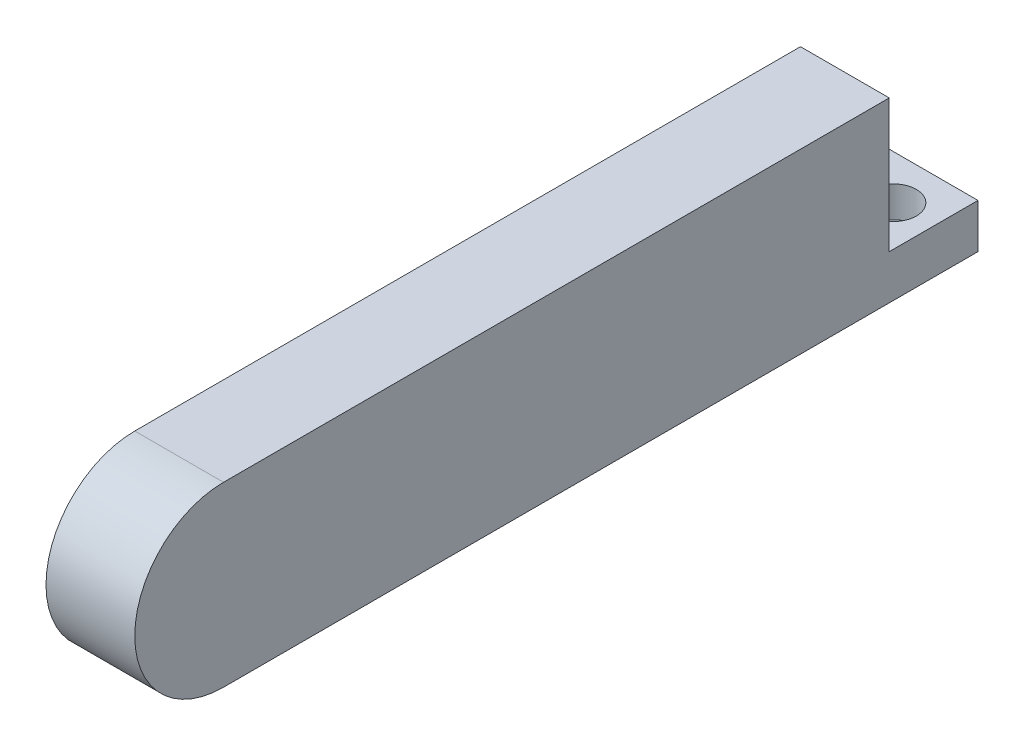
ISO-10303-21;
HEADER;
FILE_DESCRIPTION(('STEP AP214'),'2;1');
FILE_NAME('part.step','',(''),(''),'','','');
FILE_SCHEMA(('AUTOMOTIVE_DESIGN { 1 0 10303 214 1 1 1 1 }'));
ENDSEC;
DATA;
#1=APPLICATION_CONTEXT('core data for automotive mechanical design processes');
#2=APPLICATION_PROTOCOL_DEFINITION('international standard','automotive_design',2000,#1);
#3=PRODUCT_CONTEXT('',#1,'mechanical');
#4=PRODUCT('Part','Part','',(#3));
#5=PRODUCT_RELATED_PRODUCT_CATEGORY('part','',(#4));
#6=PRODUCT_DEFINITION_FORMATION('','',#4);
#7=PRODUCT_DEFINITION_CONTEXT('part definition',#1,'design');
#8=PRODUCT_DEFINITION('design','',#6,#7);
#9=PRODUCT_DEFINITION_SHAPE('','',#8);
#10=(LENGTH_UNIT() NAMED_UNIT(*) SI_UNIT(.MILLI.,.METRE.));
#11=(NAMED_UNIT(*) PLANE_ANGLE_UNIT() SI_UNIT($,.RADIAN.));
#12=(NAMED_UNIT(*) SI_UNIT($,.STERADIAN.) SOLID_ANGLE_UNIT());
#13=UNCERTAINTY_MEASURE_WITH_UNIT(LENGTH_MEASURE(1.E-05),#10,'distance_accuracy_value','');
#14=(GEOMETRIC_REPRESENTATION_CONTEXT(3) GLOBAL_UNCERTAINTY_ASSIGNED_CONTEXT((#13)) GLOBAL_UNIT_ASSIGNED_CONTEXT((#10,
#11,#12)) REPRESENTATION_CONTEXT('',''));
#15=CARTESIAN_POINT('',(0.,0.,0.));
#16=DIRECTION('',(0.,0.,1.));
#17=DIRECTION('',(1.,0.,0.));
#18=AXIS2_PLACEMENT_3D('',#15,#16,#17);
#19=CARTESIAN_POINT('',(20.,20.,150.));
#20=DIRECTION('',(-1.,0.,0.));
#21=DIRECTION('',(0.,0.,1.));
#22=AXIS2_PLACEMENT_3D('',#19,#20,#21);
#23=CYLINDRICAL_SURFACE('',#22,11.);
#24=CARTESIAN_POINT('',(0.,20.,150.));
#25=DIRECTION('',(1.,0.,0.));
#26=DIRECTION('',(0.,0.,-1.));
#27=AXIS2_PLACEMENT_3D('',#24,#25,#26);
#28=CIRCLE('',#27,11.);
#29=CARTESIAN_POINT('',(0.,20.,139.));
#30=VERTEX_POINT('',#29);
#31=EDGE_CURVE('E160',#30,#30,#28,.T.);
#32=ORIENTED_EDGE('',*,*,#31,.F.);
#33=EDGE_LOOP('',(#32));
#34=FACE_BOUND('',#33,.T.);
#35=CARTESIAN_POINT('',(7.,20.,150.));
#36=DIRECTION('',(1.,0.,0.));
#37=DIRECTION('',(0.,0.,-1.));
#38=AXIS2_PLACEMENT_3D('',#35,#36,#37);
#39=CIRCLE('',#38,11.);
#40=CARTESIAN_POINT('',(7.,20.,139.));
#41=VERTEX_POINT('',#40);
#42=EDGE_CURVE('E227',#41,#41,#39,.T.);
#43=ORIENTED_EDGE('',*,*,#42,.T.);
#44=EDGE_LOOP('',(#43));
#45=FACE_BOUND('',#44,.T.);
#46=ADVANCED_FACE('F41',(#34,#45),#23,.F.);
#47=CARTESIAN_POINT('',(20.,0.,0.));
#48=DIRECTION('',(0.,0.,-1.));
#49=DIRECTION('',(-1.,0.,0.));
#50=AXIS2_PLACEMENT_3D('',#47,#48,#49);
#51=PLANE('',#50);
#52=DIRECTION('',(0.,-1.,0.));
#53=VECTOR('',#52,1.);
#54=CARTESIAN_POINT('',(20.,0.,0.));
#55=LINE('',#54,#53);
#56=CARTESIAN_POINT('',(20.,40.,0.));
#57=VERTEX_POINT('',#56);
#58=CARTESIAN_POINT('',(20.,10.,0.));
#59=VERTEX_POINT('',#58);
#60=EDGE_CURVE('E168',#57,#59,#55,.T.);
#61=ORIENTED_EDGE('',*,*,#60,.T.);
#62=DIRECTION('',(-1.,0.,0.));
#63=VECTOR('',#62,1.);
#64=CARTESIAN_POINT('',(20.,10.,0.));
#65=LINE('',#64,#63);
#66=CARTESIAN_POINT('',(0.,10.,0.));
#67=VERTEX_POINT('',#66);
#68=EDGE_CURVE('E127',#59,#67,#65,.T.);
#69=ORIENTED_EDGE('',*,*,#68,.T.);
#70=DIRECTION('',(0.,-1.,0.));
#71=VECTOR('',#70,1.);
#72=CARTESIAN_POINT('',(0.,0.,0.));
#73=LINE('',#72,#71);
#74=CARTESIAN_POINT('',(0.,40.,0.));
#75=VERTEX_POINT('',#74);
#76=EDGE_CURVE('E184',#75,#67,#73,.T.);
#77=ORIENTED_EDGE('',*,*,#76,.F.);
#78=DIRECTION('',(-1.,0.,0.));
#79=VECTOR('',#78,1.);
#80=CARTESIAN_POINT('',(20.,40.,0.));
#81=LINE('',#80,#79);
#82=EDGE_CURVE('E192',#57,#75,#81,.T.);
#83=ORIENTED_EDGE('',*,*,#82,.F.);
#84=EDGE_LOOP('',(#61,#69,#77,#83));
#85=FACE_BOUND('',#84,.T.);
#86=ADVANCED_FACE('F217',(#85),#51,.T.);
#87=CARTESIAN_POINT('',(20.,20.,150.));
#88=DIRECTION('',(-1.,0.,0.));
#89=DIRECTION('',(0.,0.,1.));
#90=AXIS2_PLACEMENT_3D('',#87,#88,#89);
#91=CYLINDRICAL_SURFACE('',#90,20.);
#92=CARTESIAN_POINT('',(0.,20.,150.));
#93=DIRECTION('',(1.,0.,0.));
#94=DIRECTION('',(0.,0.,-1.));
#95=AXIS2_PLACEMENT_3D('',#92,#93,#94);
#96=CIRCLE('',#95,20.);
#97=CARTESIAN_POINT('',(0.,40.,150.));
#98=VERTEX_POINT('',#97);
#99=CARTESIAN_POINT('',(0.,0.,150.));
#100=VERTEX_POINT('',#99);
#101=EDGE_CURVE('E178',#98,#100,#96,.T.);
#102=ORIENTED_EDGE('',*,*,#101,.T.);
#103=DIRECTION('',(-1.,0.,0.));
#104=VECTOR('',#103,1.);
#105=CARTESIAN_POINT('',(20.,0.,150.));
#106=LINE('',#105,#104);
#107=CARTESIAN_POINT('',(20.,0.,150.));
#108=VERTEX_POINT('',#107);
#109=EDGE_CURVE('E44',#108,#100,#106,.T.);
#110=ORIENTED_EDGE('',*,*,#109,.F.);
#111=CARTESIAN_POINT('',(20.,20.,150.));
#112=DIRECTION('',(1.,0.,0.));
#113=DIRECTION('',(0.,0.,-1.));
#114=AXIS2_PLACEMENT_3D('',#111,#112,#113);
#115=CIRCLE('',#114,20.);
#116=CARTESIAN_POINT('',(20.,40.,150.));
#117=VERTEX_POINT('',#116);
#118=EDGE_CURVE('E87',#117,#108,#115,.T.);
#119=ORIENTED_EDGE('',*,*,#118,.F.);
#120=DIRECTION('',(-1.,0.,0.));
#121=VECTOR('',#120,1.);
#122=CARTESIAN_POINT('',(20.,40.,150.));
#123=LINE('',#122,#121);
#124=EDGE_CURVE('E66',#117,#98,#123,.T.);
#125=ORIENTED_EDGE('',*,*,#124,.T.);
#126=EDGE_LOOP('',(#102,#110,#119,#125));
#127=FACE_BOUND('',#126,.T.);
#128=ADVANCED_FACE('F200',(#127),#91,.T.);
#129=CARTESIAN_POINT('',(20.,0.,0.));
#130=DIRECTION('',(0.,-1.,0.));
#131=DIRECTION('',(0.,0.,-1.));
#132=AXIS2_PLACEMENT_3D('',#129,#130,#131);
#133=PLANE('',#132);
#134=CARTESIAN_POINT('',(10.900977193927,0.,-10.));
#135=DIRECTION('',(0.,1.,0.));
#136=DIRECTION('',(0.,0.,1.));
#137=AXIS2_PLACEMENT_3D('',#134,#135,#136);
#138=CIRCLE('',#137,3.15);
#139=CARTESIAN_POINT('',(10.900977193927,0.,-6.85));
#140=VERTEX_POINT('',#139);
#141=EDGE_CURVE('E234',#140,#140,#138,.T.);
#142=ORIENTED_EDGE('',*,*,#141,.T.);
#143=EDGE_LOOP('',(#142));
#144=FACE_BOUND('',#143,.T.);
#145=CARTESIAN_POINT('',(-10.,0.,59.0289112452638));
#146=DIRECTION('',(0.,1.,0.));
#147=DIRECTION('',(0.,0.,1.));
#148=AXIS2_PLACEMENT_3D('',#145,#146,#147);
#149=CIRCLE('',#148,3.15);
#150=CARTESIAN_POINT('',(-10.,0.,62.1789112452638));
#151=VERTEX_POINT('',#150);
#152=EDGE_CURVE('E241',#151,#151,#149,.T.);
#153=ORIENTED_EDGE('',*,*,#152,.T.);
#154=EDGE_LOOP('',(#153));
#155=FACE_BOUND('',#154,.T.);
#156=CARTESIAN_POINT('',(-10.,0.,17.7070334327709));
#157=DIRECTION('',(0.,1.,0.));
#158=DIRECTION('',(0.,0.,1.));
#159=AXIS2_PLACEMENT_3D('',#156,#157,#158);
#160=CIRCLE('',#159,3.15);
#161=CARTESIAN_POINT('',(-10.,0.,20.8570334327709));
#162=VERTEX_POINT('',#161);
#163=EDGE_CURVE('E249',#162,#162,#160,.T.);
#164=ORIENTED_EDGE('',*,*,#163,.T.);
#165=EDGE_LOOP('',(#164));
#166=FACE_BOUND('',#165,.T.);
#167=DIRECTION('',(0.,0.,1.));
#168=VECTOR('',#167,1.);
#169=CARTESIAN_POINT('',(0.,0.,0.));
#170=LINE('',#169,#168);
#171=CARTESIAN_POINT('',(0.,0.,75.));
#172=VERTEX_POINT('',#171);
#173=EDGE_CURVE('E181',#172,#100,#170,.T.);
#174=ORIENTED_EDGE('',*,*,#173,.F.);
#175=DIRECTION('',(-1.,0.,0.));
#176=VECTOR('',#175,1.);
#177=CARTESIAN_POINT('',(0.,0.,75.));
#178=LINE('',#177,#176);
#179=CARTESIAN_POINT('',(-20.,0.,75.));
#180=VERTEX_POINT('',#179);
#181=EDGE_CURVE('E57',#172,#180,#178,.T.);
#182=ORIENTED_EDGE('',*,*,#181,.T.);
#183=DIRECTION('',(0.,0.,1.));
#184=VECTOR('',#183,1.);
#185=CARTESIAN_POINT('',(-20.,0.,-20.));
#186=LINE('',#185,#184);
#187=CARTESIAN_POINT('',(-20.,0.,-20.));
#188=VERTEX_POINT('',#187);
#189=EDGE_CURVE('E277',#188,#180,#186,.T.);
#190=ORIENTED_EDGE('',*,*,#189,.F.);
#191=DIRECTION('',(-1.,0.,0.));
#192=VECTOR('',#191,1.);
#193=CARTESIAN_POINT('',(20.,0.,-20.));
#194=LINE('',#193,#192);
#195=CARTESIAN_POINT('',(20.,0.,-20.));
#196=VERTEX_POINT('',#195);
#197=EDGE_CURVE('E128',#196,#188,#194,.T.);
#198=ORIENTED_EDGE('',*,*,#197,.F.);
#199=DIRECTION('',(0.,0.,1.));
#200=VECTOR('',#199,1.);
#201=CARTESIAN_POINT('',(20.,0.,0.));
#202=LINE('',#201,#200);
#203=EDGE_CURVE('E163',#196,#108,#202,.T.);
#204=ORIENTED_EDGE('',*,*,#203,.T.);
#205=ORIENTED_EDGE('',*,*,#109,.T.);
#206=EDGE_LOOP('',(#174,#182,#190,#198,#204,#205));
#207=FACE_BOUND('',#206,.T.);
#208=ADVANCED_FACE('F199',(#144,#155,#166,#207),#133,.T.);
#209=CARTESIAN_POINT('',(20.,40.,0.));
#210=DIRECTION('',(0.,1.,0.));
#211=DIRECTION('',(0.,0.,1.));
#212=AXIS2_PLACEMENT_3D('',#209,#210,#211);
#213=PLANE('',#212);
#214=DIRECTION('',(0.,0.,-1.));
#215=VECTOR('',#214,1.);
#216=CARTESIAN_POINT('',(0.,40.,0.));
#217=LINE('',#216,#215);
#218=EDGE_CURVE('E164',#98,#75,#217,.T.);
#219=ORIENTED_EDGE('',*,*,#218,.F.);
#220=ORIENTED_EDGE('',*,*,#124,.F.);
#221=DIRECTION('',(0.,0.,-1.));
#222=VECTOR('',#221,1.);
#223=CARTESIAN_POINT('',(20.,40.,0.));
#224=LINE('',#223,#222);
#225=EDGE_CURVE('E172',#117,#57,#224,.T.);
#226=ORIENTED_EDGE('',*,*,#225,.T.);
#227=ORIENTED_EDGE('',*,*,#82,.T.);
#228=EDGE_LOOP('',(#219,#220,#226,#227));
#229=FACE_BOUND('',#228,.T.);
#230=ADVANCED_FACE('F203',(#229),#213,.T.);
#231=CARTESIAN_POINT('',(20.,0.,0.));
#232=DIRECTION('',(1.,0.,0.));
#233=DIRECTION('',(0.,0.,-1.));
#234=AXIS2_PLACEMENT_3D('',#231,#232,#233);
#235=PLANE('',#234);
#236=ORIENTED_EDGE('',*,*,#118,.T.);
#237=ORIENTED_EDGE('',*,*,#203,.F.);
#238=DIRECTION('',(0.,-1.,0.));
#239=VECTOR('',#238,1.);
#240=CARTESIAN_POINT('',(20.,10.,-20.));
#241=LINE('',#240,#239);
#242=CARTESIAN_POINT('',(20.,10.,-20.));
#243=VERTEX_POINT('',#242);
#244=EDGE_CURVE('E156',#243,#196,#241,.T.);
#245=ORIENTED_EDGE('',*,*,#244,.F.);
#246=DIRECTION('',(0.,0.,-1.));
#247=VECTOR('',#246,1.);
#248=CARTESIAN_POINT('',(20.,10.,0.));
#249=LINE('',#248,#247);
#250=EDGE_CURVE('E121',#59,#243,#249,.T.);
#251=ORIENTED_EDGE('',*,*,#250,.F.);
#252=ORIENTED_EDGE('',*,*,#60,.F.);
#253=ORIENTED_EDGE('',*,*,#225,.F.);
#254=EDGE_LOOP('',(#236,#237,#245,#251,#252,#253));
#255=FACE_BOUND('',#254,.T.);
#256=ADVANCED_FACE('F205',(#255),#235,.T.);
#257=CARTESIAN_POINT('',(0.,0.,0.));
#258=DIRECTION('',(1.,0.,0.));
#259=DIRECTION('',(0.,0.,-1.));
#260=AXIS2_PLACEMENT_3D('',#257,#258,#259);
#261=PLANE('',#260);
#262=ORIENTED_EDGE('',*,*,#31,.T.);
#263=EDGE_LOOP('',(#262));
#264=FACE_BOUND('',#263,.T.);
#265=ORIENTED_EDGE('',*,*,#76,.T.);
#266=DIRECTION('',(0.,0.,1.));
#267=VECTOR('',#266,1.);
#268=CARTESIAN_POINT('',(0.,10.,-20.));
#269=LINE('',#268,#267);
#270=CARTESIAN_POINT('',(0.,10.,75.));
#271=VERTEX_POINT('',#270);
#272=EDGE_CURVE('E11',#67,#271,#269,.T.);
#273=ORIENTED_EDGE('',*,*,#272,.T.);
#274=DIRECTION('',(0.,-1.,0.));
#275=VECTOR('',#274,1.);
#276=CARTESIAN_POINT('',(0.,10.,75.));
#277=LINE('',#276,#275);
#278=EDGE_CURVE('E148',#271,#172,#277,.T.);
#279=ORIENTED_EDGE('',*,*,#278,.T.);
#280=ORIENTED_EDGE('',*,*,#173,.T.);
#281=ORIENTED_EDGE('',*,*,#101,.F.);
#282=ORIENTED_EDGE('',*,*,#218,.T.);
#283=EDGE_LOOP('',(#265,#273,#279,#280,#281,#282));
#284=FACE_BOUND('',#283,.T.);
#285=ADVANCED_FACE('F202',(#264,#284),#261,.F.);
#286=CARTESIAN_POINT('',(20.,10.,-20.));
#287=DIRECTION('',(0.,0.,1.));
#288=DIRECTION('',(1.,0.,0.));
#289=AXIS2_PLACEMENT_3D('',#286,#287,#288);
#290=PLANE('',#289);
#291=ORIENTED_EDGE('',*,*,#197,.T.);
#292=DIRECTION('',(0.,-1.,0.));
#293=VECTOR('',#292,1.);
#294=CARTESIAN_POINT('',(-20.,10.,-20.));
#295=LINE('',#294,#293);
#296=CARTESIAN_POINT('',(-20.,10.,-20.));
#297=VERTEX_POINT('',#296);
#298=EDGE_CURVE('E134',#297,#188,#295,.T.);
#299=ORIENTED_EDGE('',*,*,#298,.F.);
#300=DIRECTION('',(-1.,0.,0.));
#301=VECTOR('',#300,1.);
#302=CARTESIAN_POINT('',(20.,10.,-20.));
#303=LINE('',#302,#301);
#304=EDGE_CURVE('E114',#243,#297,#303,.T.);
#305=ORIENTED_EDGE('',*,*,#304,.F.);
#306=ORIENTED_EDGE('',*,*,#244,.T.);
#307=EDGE_LOOP('',(#291,#299,#305,#306));
#308=FACE_BOUND('',#307,.T.);
#309=ADVANCED_FACE('F140',(#308),#290,.F.);
#310=CARTESIAN_POINT('',(0.,10.,0.));
#311=DIRECTION('',(0.,-1.,0.));
#312=DIRECTION('',(0.,0.,-1.));
#313=AXIS2_PLACEMENT_3D('',#310,#311,#312);
#314=PLANE('',#313);
#315=CARTESIAN_POINT('',(10.900977193927,10.,-10.));
#316=DIRECTION('',(0.,1.,0.));
#317=DIRECTION('',(0.,0.,1.));
#318=AXIS2_PLACEMENT_3D('',#315,#316,#317);
#319=CIRCLE('',#318,5.2);
#320=CARTESIAN_POINT('',(10.900977193927,10.,-4.8));
#321=VERTEX_POINT('',#320);
#322=EDGE_CURVE('E253',#321,#321,#319,.T.);
#323=ORIENTED_EDGE('',*,*,#322,.F.);
#324=EDGE_LOOP('',(#323));
#325=FACE_BOUND('',#324,.T.);
#326=CARTESIAN_POINT('',(-10.,10.,17.7070334327709));
#327=DIRECTION('',(0.,1.,0.));
#328=DIRECTION('',(0.,0.,1.));
#329=AXIS2_PLACEMENT_3D('',#326,#327,#328);
#330=CIRCLE('',#329,5.2);
#331=CARTESIAN_POINT('',(-10.,10.,22.9070334327709));
#332=VERTEX_POINT('',#331);
#333=EDGE_CURVE('E261',#332,#332,#330,.T.);
#334=ORIENTED_EDGE('',*,*,#333,.F.);
#335=EDGE_LOOP('',(#334));
#336=FACE_BOUND('',#335,.T.);
#337=CARTESIAN_POINT('',(-10.,10.,59.0289112452638));
#338=DIRECTION('',(0.,1.,0.));
#339=DIRECTION('',(0.,0.,1.));
#340=AXIS2_PLACEMENT_3D('',#337,#338,#339);
#341=CIRCLE('',#340,5.2);
#342=CARTESIAN_POINT('',(-10.,10.,64.2289112452638));
#343=VERTEX_POINT('',#342);
#344=EDGE_CURVE('E269',#343,#343,#341,.T.);
#345=ORIENTED_EDGE('',*,*,#344,.F.);
#346=EDGE_LOOP('',(#345));
#347=FACE_BOUND('',#346,.T.);
#348=ORIENTED_EDGE('',*,*,#304,.T.);
#349=DIRECTION('',(0.,0.,1.));
#350=VECTOR('',#349,1.);
#351=CARTESIAN_POINT('',(-20.,10.,-20.));
#352=LINE('',#351,#350);
#353=CARTESIAN_POINT('',(-20.,10.,75.));
#354=VERTEX_POINT('',#353);
#355=EDGE_CURVE('E118',#297,#354,#352,.T.);
#356=ORIENTED_EDGE('',*,*,#355,.T.);
#357=DIRECTION('',(-1.,0.,0.));
#358=VECTOR('',#357,1.);
#359=CARTESIAN_POINT('',(0.,10.,75.));
#360=LINE('',#359,#358);
#361=EDGE_CURVE('E138',#271,#354,#360,.T.);
#362=ORIENTED_EDGE('',*,*,#361,.F.);
#363=ORIENTED_EDGE('',*,*,#272,.F.);
#364=ORIENTED_EDGE('',*,*,#68,.F.);
#365=ORIENTED_EDGE('',*,*,#250,.T.);
#366=EDGE_LOOP('',(#348,#356,#362,#363,#364,#365));
#367=FACE_BOUND('',#366,.T.);
#368=ADVANCED_FACE('F116',(#325,#336,#347,#367),#314,.F.);
#369=CARTESIAN_POINT('',(-20.,10.,-20.));
#370=DIRECTION('',(1.,0.,0.));
#371=DIRECTION('',(0.,0.,-1.));
#372=AXIS2_PLACEMENT_3D('',#369,#370,#371);
#373=PLANE('',#372);
#374=ORIENTED_EDGE('',*,*,#189,.T.);
#375=DIRECTION('',(0.,-1.,0.));
#376=VECTOR('',#375,1.);
#377=CARTESIAN_POINT('',(-20.,10.,75.));
#378=LINE('',#377,#376);
#379=EDGE_CURVE('E135',#354,#180,#378,.T.);
#380=ORIENTED_EDGE('',*,*,#379,.F.);
#381=ORIENTED_EDGE('',*,*,#355,.F.);
#382=ORIENTED_EDGE('',*,*,#298,.T.);
#383=EDGE_LOOP('',(#374,#380,#381,#382));
#384=FACE_BOUND('',#383,.T.);
#385=ADVANCED_FACE('F133',(#384),#373,.F.);
#386=CARTESIAN_POINT('',(0.,10.,75.));
#387=DIRECTION('',(0.,0.,1.));
#388=DIRECTION('',(1.,0.,0.));
#389=AXIS2_PLACEMENT_3D('',#386,#387,#388);
#390=PLANE('',#389);
#391=ORIENTED_EDGE('',*,*,#181,.F.);
#392=ORIENTED_EDGE('',*,*,#278,.F.);
#393=ORIENTED_EDGE('',*,*,#361,.T.);
#394=ORIENTED_EDGE('',*,*,#379,.T.);
#395=EDGE_LOOP('',(#391,#392,#393,#394));
#396=FACE_BOUND('',#395,.T.);
#397=ADVANCED_FACE('F287',(#396),#390,.T.);
#398=CARTESIAN_POINT('',(-10.,3.,59.0289112452638));
#399=DIRECTION('',(0.,1.,0.));
#400=DIRECTION('',(0.,0.,1.));
#401=AXIS2_PLACEMENT_3D('',#398,#399,#400);
#402=CYLINDRICAL_SURFACE('',#401,5.2);
#403=CARTESIAN_POINT('',(-10.,3.,59.0289112452638));
#404=DIRECTION('',(0.,1.,0.));
#405=DIRECTION('',(0.,0.,1.));
#406=AXIS2_PLACEMENT_3D('',#403,#404,#405);
#407=CIRCLE('',#406,5.2);
#408=CARTESIAN_POINT('',(-10.,3.,64.2289112452638));
#409=VERTEX_POINT('',#408);
#410=EDGE_CURVE('E273',#409,#409,#407,.T.);
#411=ORIENTED_EDGE('',*,*,#410,.F.);
#412=EDGE_LOOP('',(#411));
#413=FACE_BOUND('',#412,.T.);
#414=ORIENTED_EDGE('',*,*,#344,.T.);
#415=EDGE_LOOP('',(#414));
#416=FACE_BOUND('',#415,.T.);
#417=ADVANCED_FACE('F290',(#413,#416),#402,.F.);
#418=CARTESIAN_POINT('',(-10.,3.,59.0289112452638));
#419=DIRECTION('',(0.,1.,0.));
#420=DIRECTION('',(0.,0.,1.));
#421=AXIS2_PLACEMENT_3D('',#418,#419,#420);
#422=PLANE('',#421);
#423=CARTESIAN_POINT('',(-10.,3.,59.0289112452638));
#424=DIRECTION('',(0.,1.,0.));
#425=DIRECTION('',(0.,0.,1.));
#426=AXIS2_PLACEMENT_3D('',#423,#424,#425);
#427=CIRCLE('',#426,3.15);
#428=CARTESIAN_POINT('',(-10.,3.,62.1789112452638));
#429=VERTEX_POINT('',#428);
#430=EDGE_CURVE('E239',#429,#429,#427,.T.);
#431=ORIENTED_EDGE('',*,*,#430,.F.);
#432=EDGE_LOOP('',(#431));
#433=FACE_BOUND('',#432,.T.);
#434=ORIENTED_EDGE('',*,*,#410,.T.);
#435=EDGE_LOOP('',(#434));
#436=FACE_BOUND('',#435,.T.);
#437=ADVANCED_FACE('F296',(#433,#436),#422,.T.);
#438=CARTESIAN_POINT('',(-10.,3.,17.7070334327709));
#439=DIRECTION('',(0.,1.,0.));
#440=DIRECTION('',(0.,0.,1.));
#441=AXIS2_PLACEMENT_3D('',#438,#439,#440);
#442=CYLINDRICAL_SURFACE('',#441,5.2);
#443=CARTESIAN_POINT('',(-10.,3.,17.7070334327709));
#444=DIRECTION('',(0.,1.,0.));
#445=DIRECTION('',(0.,0.,1.));
#446=AXIS2_PLACEMENT_3D('',#443,#444,#445);
#447=CIRCLE('',#446,5.2);
#448=CARTESIAN_POINT('',(-10.,3.,22.9070334327709));
#449=VERTEX_POINT('',#448);
#450=EDGE_CURVE('E265',#449,#449,#447,.T.);
#451=ORIENTED_EDGE('',*,*,#450,.F.);
#452=EDGE_LOOP('',(#451));
#453=FACE_BOUND('',#452,.T.);
#454=ORIENTED_EDGE('',*,*,#333,.T.);
#455=EDGE_LOOP('',(#454));
#456=FACE_BOUND('',#455,.T.);
#457=ADVANCED_FACE('F343',(#453,#456),#442,.F.);
#458=CARTESIAN_POINT('',(-10.,3.,17.7070334327709));
#459=DIRECTION('',(0.,1.,0.));
#460=DIRECTION('',(0.,0.,1.));
#461=AXIS2_PLACEMENT_3D('',#458,#459,#460);
#462=PLANE('',#461);
#463=CARTESIAN_POINT('',(-10.,3.,17.7070334327709));
#464=DIRECTION('',(0.,1.,0.));
#465=DIRECTION('',(0.,0.,1.));
#466=AXIS2_PLACEMENT_3D('',#463,#464,#465);
#467=CIRCLE('',#466,3.15);
#468=CARTESIAN_POINT('',(-10.,3.,20.8570334327709));
#469=VERTEX_POINT('',#468);
#470=EDGE_CURVE('E245',#469,#469,#467,.T.);
#471=ORIENTED_EDGE('',*,*,#470,.F.);
#472=EDGE_LOOP('',(#471));
#473=FACE_BOUND('',#472,.T.);
#474=ORIENTED_EDGE('',*,*,#450,.T.);
#475=EDGE_LOOP('',(#474));
#476=FACE_BOUND('',#475,.T.);
#477=ADVANCED_FACE('F347',(#473,#476),#462,.T.);
#478=CARTESIAN_POINT('',(10.900977193927,3.,-10.));
#479=DIRECTION('',(0.,1.,0.));
#480=DIRECTION('',(0.,0.,1.));
#481=AXIS2_PLACEMENT_3D('',#478,#479,#480);
#482=CYLINDRICAL_SURFACE('',#481,5.2);
#483=CARTESIAN_POINT('',(10.900977193927,3.,-10.));
#484=DIRECTION('',(0.,1.,0.));
#485=DIRECTION('',(0.,0.,1.));
#486=AXIS2_PLACEMENT_3D('',#483,#484,#485);
#487=CIRCLE('',#486,5.2);
#488=CARTESIAN_POINT('',(10.900977193927,3.,-4.8));
#489=VERTEX_POINT('',#488);
#490=EDGE_CURVE('E257',#489,#489,#487,.T.);
#491=ORIENTED_EDGE('',*,*,#490,.F.);
#492=EDGE_LOOP('',(#491));
#493=FACE_BOUND('',#492,.T.);
#494=ORIENTED_EDGE('',*,*,#322,.T.);
#495=EDGE_LOOP('',(#494));
#496=FACE_BOUND('',#495,.T.);
#497=ADVANCED_FACE('F360',(#493,#496),#482,.F.);
#498=CARTESIAN_POINT('',(10.900977193927,3.,-10.));
#499=DIRECTION('',(0.,1.,0.));
#500=DIRECTION('',(0.,0.,1.));
#501=AXIS2_PLACEMENT_3D('',#498,#499,#500);
#502=PLANE('',#501);
#503=CARTESIAN_POINT('',(10.900977193927,3.,-10.));
#504=DIRECTION('',(0.,1.,0.));
#505=DIRECTION('',(0.,0.,1.));
#506=AXIS2_PLACEMENT_3D('',#503,#504,#505);
#507=CIRCLE('',#506,3.15);
#508=CARTESIAN_POINT('',(10.900977193927,3.,-6.85));
#509=VERTEX_POINT('',#508);
#510=EDGE_CURVE('E230',#509,#509,#507,.T.);
#511=ORIENTED_EDGE('',*,*,#510,.F.);
#512=EDGE_LOOP('',(#511));
#513=FACE_BOUND('',#512,.T.);
#514=ORIENTED_EDGE('',*,*,#490,.T.);
#515=EDGE_LOOP('',(#514));
#516=FACE_BOUND('',#515,.T.);
#517=ADVANCED_FACE('F367',(#513,#516),#502,.T.);
#518=CARTESIAN_POINT('',(-10.,0.,17.7070334327709));
#519=DIRECTION('',(0.,1.,0.));
#520=DIRECTION('',(0.,0.,1.));
#521=AXIS2_PLACEMENT_3D('',#518,#519,#520);
#522=CYLINDRICAL_SURFACE('',#521,3.15);
#523=ORIENTED_EDGE('',*,*,#163,.F.);
#524=EDGE_LOOP('',(#523));
#525=FACE_BOUND('',#524,.T.);
#526=ORIENTED_EDGE('',*,*,#470,.T.);
#527=EDGE_LOOP('',(#526));
#528=FACE_BOUND('',#527,.T.);
#529=ADVANCED_FACE('F375',(#525,#528),#522,.F.);
#530=CARTESIAN_POINT('',(-10.,0.,59.0289112452638));
#531=DIRECTION('',(0.,1.,0.));
#532=DIRECTION('',(0.,0.,1.));
#533=AXIS2_PLACEMENT_3D('',#530,#531,#532);
#534=CYLINDRICAL_SURFACE('',#533,3.15);
#535=ORIENTED_EDGE('',*,*,#152,.F.);
#536=EDGE_LOOP('',(#535));
#537=FACE_BOUND('',#536,.T.);
#538=ORIENTED_EDGE('',*,*,#430,.T.);
#539=EDGE_LOOP('',(#538));
#540=FACE_BOUND('',#539,.T.);
#541=ADVANCED_FACE('F384',(#537,#540),#534,.F.);
#542=CARTESIAN_POINT('',(10.900977193927,0.,-10.));
#543=DIRECTION('',(0.,1.,0.));
#544=DIRECTION('',(0.,0.,1.));
#545=AXIS2_PLACEMENT_3D('',#542,#543,#544);
#546=CYLINDRICAL_SURFACE('',#545,3.15);
#547=ORIENTED_EDGE('',*,*,#141,.F.);
#548=EDGE_LOOP('',(#547));
#549=FACE_BOUND('',#548,.T.);
#550=ORIENTED_EDGE('',*,*,#510,.T.);
#551=EDGE_LOOP('',(#550));
#552=FACE_BOUND('',#551,.T.);
#553=ADVANCED_FACE('F392',(#549,#552),#546,.F.);
#554=CARTESIAN_POINT('',(7.,20.,150.));
#555=DIRECTION('',(1.,0.,0.));
#556=DIRECTION('',(0.,0.,-1.));
#557=AXIS2_PLACEMENT_3D('',#554,#555,#556);
#558=PLANE('',#557);
#559=ORIENTED_EDGE('',*,*,#42,.F.);
#560=EDGE_LOOP('',(#559));
#561=FACE_BOUND('',#560,.T.);
#562=ADVANCED_FACE('F399',(#561),#558,.F.);
#563=CLOSED_SHELL('',(#46,#86,#128,#208,#230,#256,#285,#309,#368,#385,#397,#417,#437,#457,#477,
#497,#517,#529,#541,#553,#562));
#564=MANIFOLD_SOLID_BREP('B2',#563);
#565=ADVANCED_BREP_SHAPE_REPRESENTATION('',(#18,#564),#14);
#566=SHAPE_DEFINITION_REPRESENTATION(#9,#565);
ENDSEC;
END-ISO-10303-21;
